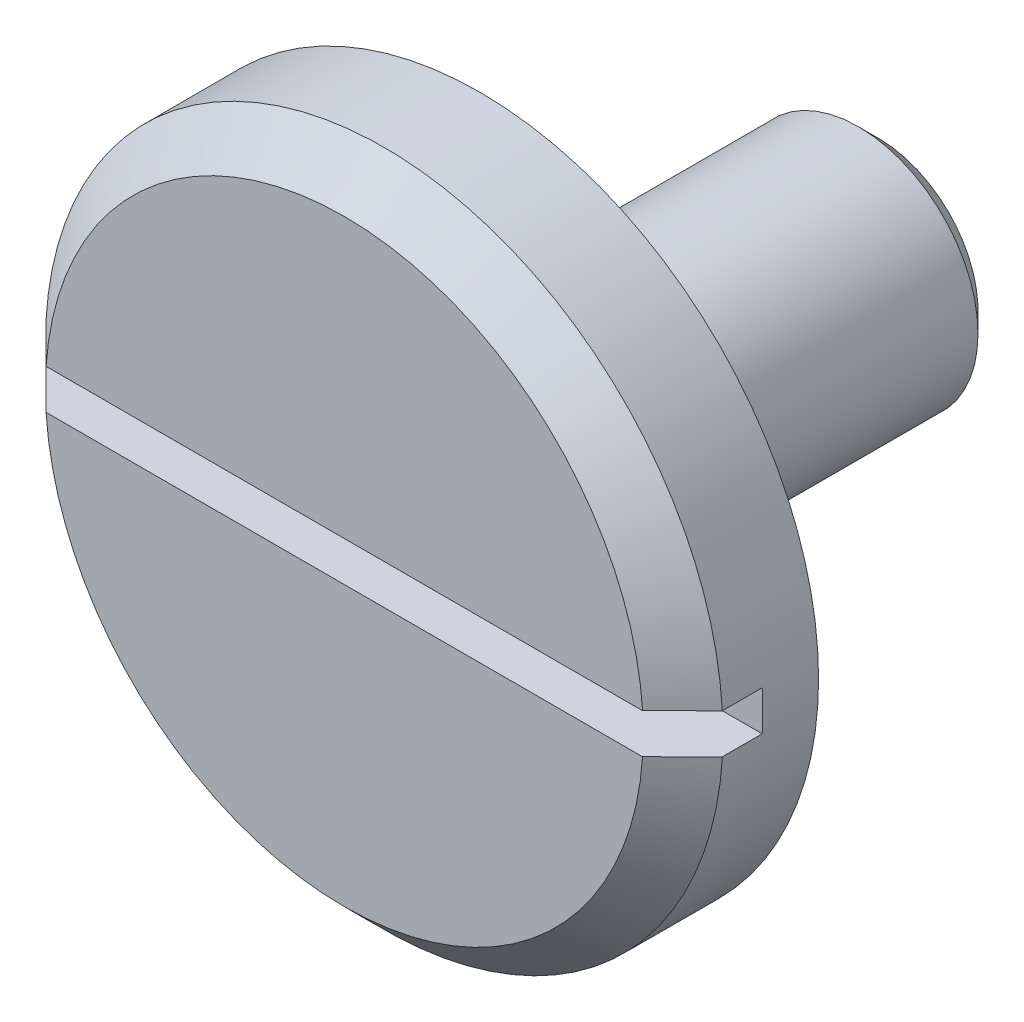
ISO-10303-21;
HEADER;
FILE_DESCRIPTION(('STEP AP214'),'2;1');
FILE_NAME('part.step','',(''),(''),'','','');
FILE_SCHEMA(('AUTOMOTIVE_DESIGN { 1 0 10303 214 1 1 1 1 }'));
ENDSEC;
DATA;
#1=APPLICATION_CONTEXT('core data for automotive mechanical design processes');
#2=APPLICATION_PROTOCOL_DEFINITION('international standard','automotive_design',2000,#1);
#3=PRODUCT_CONTEXT('',#1,'mechanical');
#4=PRODUCT('Part','Part','',(#3));
#5=PRODUCT_RELATED_PRODUCT_CATEGORY('part','',(#4));
#6=PRODUCT_DEFINITION_FORMATION('','',#4);
#7=PRODUCT_DEFINITION_CONTEXT('part definition',#1,'design');
#8=PRODUCT_DEFINITION('design','',#6,#7);
#9=PRODUCT_DEFINITION_SHAPE('','',#8);
#10=(LENGTH_UNIT() NAMED_UNIT(*) SI_UNIT(.MILLI.,.METRE.));
#11=(NAMED_UNIT(*) PLANE_ANGLE_UNIT() SI_UNIT($,.RADIAN.));
#12=(NAMED_UNIT(*) SI_UNIT($,.STERADIAN.) SOLID_ANGLE_UNIT());
#13=UNCERTAINTY_MEASURE_WITH_UNIT(LENGTH_MEASURE(1.E-05),#10,'distance_accuracy_value','');
#14=(GEOMETRIC_REPRESENTATION_CONTEXT(3) GLOBAL_UNCERTAINTY_ASSIGNED_CONTEXT((#13)) GLOBAL_UNIT_ASSIGNED_CONTEXT((#10,
#11,#12)) REPRESENTATION_CONTEXT('',''));
#15=CARTESIAN_POINT('',(0.,0.,0.));
#16=DIRECTION('',(0.,0.,1.));
#17=DIRECTION('',(1.,0.,0.));
#18=AXIS2_PLACEMENT_3D('',#15,#16,#17);
#19=CARTESIAN_POINT('',(0.,0.,1.7));
#20=DIRECTION('',(0.,0.,1.));
#21=DIRECTION('',(1.,0.,0.));
#22=AXIS2_PLACEMENT_3D('',#19,#20,#21);
#23=PLANE('',#22);
#24=DIRECTION('',(1.,0.,0.));
#25=VECTOR('',#24,1.);
#26=CARTESIAN_POINT('',(0.,-0.25,1.7));
#27=LINE('',#26,#25);
#28=CARTESIAN_POINT('',(-3.74165738677394,-0.25,1.7));
#29=VERTEX_POINT('',#28);
#30=CARTESIAN_POINT('',(3.74165738677394,-0.25,1.7));
#31=VERTEX_POINT('',#30);
#32=EDGE_CURVE('E148',#29,#31,#27,.T.);
#33=ORIENTED_EDGE('',*,*,#32,.F.);
#34=CARTESIAN_POINT('',(0.,0.,1.7));
#35=DIRECTION('',(0.,0.,1.));
#36=DIRECTION('',(1.,0.,0.));
#37=AXIS2_PLACEMENT_3D('',#34,#35,#36);
#38=CIRCLE('',#37,3.75);
#39=EDGE_CURVE('E146',#29,#31,#38,.T.);
#40=ORIENTED_EDGE('',*,*,#39,.T.);
#41=EDGE_LOOP('',(#33,#40));
#42=FACE_BOUND('',#41,.T.);
#43=ADVANCED_FACE('F17',(#42),#23,.T.);
#44=CARTESIAN_POINT('',(0.,0.,1.7));
#45=DIRECTION('',(0.,0.,-1.));
#46=DIRECTION('',(-1.,0.,0.));
#47=AXIS2_PLACEMENT_3D('',#44,#45,#46);
#48=CONICAL_SURFACE('',#47,3.75,0.785398163397446);
#49=CARTESIAN_POINT('',(-9.35567628765958,-0.25,-3.90901590977793));
#50=CARTESIAN_POINT('',(-9.03289795511798,-0.25,-3.58635366815301));
#51=CARTESIAN_POINT('',(-8.71011452870455,-0.25,-3.26369652197986));
#52=CARTESIAN_POINT('',(-8.06453073076949,-0.25,-2.61839880551686));
#53=CARTESIAN_POINT('',(-7.74173035923807,-0.25,-2.2957582352368));
#54=CARTESIAN_POINT('',(-7.09610227505754,-0.25,-1.65049641906794));
#55=CARTESIAN_POINT('',(-6.77327456211828,-0.25,-1.32787517346944));
#56=CARTESIAN_POINT('',(-6.12758359196436,-0.25,-0.682668622659213));
#57=CARTESIAN_POINT('',(-5.80472033477004,-0.25,-0.36008331742714));
#58=CARTESIAN_POINT('',(-5.15827646112178,-0.25,0.285690453985219));
#59=CARTESIAN_POINT('',(-4.83469572847146,-0.25,0.608878803879873));
#60=CARTESIAN_POINT('',(-4.18742956751692,-0.25,1.25515169326864));
#61=CARTESIAN_POINT('',(-3.86374413903944,-0.25,1.57823623258917));
#62=CARTESIAN_POINT('',(-3.21617952646215,-0.25,2.22420650381016));
#63=CARTESIAN_POINT('',(-2.89230034381217,-0.25,2.54709223716245));
#64=CARTESIAN_POINT('',(-2.40607894141502,-0.25,3.03101538689873));
#65=CARTESIAN_POINT('',(-2.24393826138762,-0.25,3.19225530473262));
#66=CARTESIAN_POINT('',(-1.91940680223726,-0.25,3.51448318198386));
#67=CARTESIAN_POINT('',(-1.75701602349966,-0.25,3.67547114178867));
#68=CARTESIAN_POINT('',(-1.50530141866896,-0.25,3.92413946138201));
#69=CARTESIAN_POINT('',(-1.41617455837397,-0.25,4.01201917295412));
#70=CARTESIAN_POINT('',(-1.23765038056176,-0.25,4.18746480083215));
#71=CARTESIAN_POINT('',(-1.14825312704963,-0.25,4.27503078208907));
#72=CARTESIAN_POINT('',(-0.998577315255739,-0.25,4.42069391489895));
#73=CARTESIAN_POINT('',(-0.938454879044106,-0.25,4.47895147271359));
#74=CARTESIAN_POINT('',(-0.817756566178237,-0.25,4.59504780670183));
#75=CARTESIAN_POINT('',(-0.757180512126432,-0.25,4.65288639954022));
#76=CARTESIAN_POINT('',(-0.655349243453546,-0.25,4.74871800148552));
#77=CARTESIAN_POINT('',(-0.61432302351699,-0.25,4.78695420897481));
#78=CARTESIAN_POINT('',(-0.531691585641791,-0.25,4.86270603450101));
#79=CARTESIAN_POINT('',(-0.490087104542302,-0.25,4.90022244632364));
#80=CARTESIAN_POINT('',(-0.421254782066491,-0.25,4.96031538450716));
#81=CARTESIAN_POINT('',(-0.394383398287751,-0.25,4.9832991654084));
#82=CARTESIAN_POINT('',(-0.339786218340251,-0.25,5.02844131170172));
#83=CARTESIAN_POINT('',(-0.312057828764228,-0.25,5.05059660639396));
#84=CARTESIAN_POINT('',(-0.269353377422057,-0.25,5.08262575986691));
#85=CARTESIAN_POINT('',(-0.254865443823042,-0.25,5.09314613685171));
#86=CARTESIAN_POINT('',(-0.225439804610927,-0.25,5.11353349573733));
#87=CARTESIAN_POINT('',(-0.210502265739991,-0.25,5.12340071563076));
#88=CARTESIAN_POINT('',(-0.180070613664776,-0.25,5.1421332304044));
#89=CARTESIAN_POINT('',(-0.164578557922666,-0.25,5.15100180701027));
#90=CARTESIAN_POINT('',(-0.132836114570933,-0.25,5.16722892063403));
#91=CARTESIAN_POINT('',(-0.116587152438204,-0.25,5.17459016565737));
#92=CARTESIAN_POINT('',(-0.0828789519828765,-0.25,5.18709143745283));
#93=CARTESIAN_POINT('',(-0.0654034217319248,-0.25,5.19218999585914));
#94=CARTESIAN_POINT('',(-0.0298594686385596,-0.25,5.19881595864399));
#95=CARTESIAN_POINT('',(-0.0117961010499945,-0.25,5.20036831452469));
#96=CARTESIAN_POINT('',(0.0242801156069588,-0.25,5.19947586860602));
#97=CARTESIAN_POINT('',(0.0422926209502668,-0.25,5.19701833016421));
#98=CARTESIAN_POINT('',(0.0776232839262932,-0.25,5.18880295755528));
#99=CARTESIAN_POINT('',(0.094935354644901,-0.25,5.18302096366588));
#100=CARTESIAN_POINT('',(0.131813374015776,-0.25,5.16797456650949));
#101=CARTESIAN_POINT('',(0.151185880811856,-0.25,5.15825821867508));
#102=CARTESIAN_POINT('',(0.188936224675288,-0.25,5.13702445076799));
#103=CARTESIAN_POINT('',(0.207311473331325,-0.25,5.12550261980762));
#104=CARTESIAN_POINT('',(0.243451913275515,-0.25,5.10130526058208));
#105=CARTESIAN_POINT('',(0.261212230639947,-0.25,5.08862256455291));
#106=CARTESIAN_POINT('',(0.296188825238547,-0.25,5.06258111466196));
#107=CARTESIAN_POINT('',(0.31340576218893,-0.25,5.04922323620344));
#108=CARTESIAN_POINT('',(0.369750110452784,-0.25,5.00430823576812));
#109=CARTESIAN_POINT('',(0.408101593520283,-0.25,4.97178480734219));
#110=CARTESIAN_POINT('',(0.483870367767817,-0.25,4.90566250823166));
#111=CARTESIAN_POINT('',(0.52128725719143,-0.25,4.87206318874593));
#112=CARTESIAN_POINT('',(0.595623575443264,-0.25,4.80421715174497));
#113=CARTESIAN_POINT('',(0.632542257663815,-0.25,4.76996961512057));
#114=CARTESIAN_POINT('',(0.706032816764809,-0.25,4.70112058074332));
#115=CARTESIAN_POINT('',(0.74260475854595,-0.25,4.66651915185493));
#116=CARTESIAN_POINT('',(0.851628828675026,-0.25,4.56271770193691));
#117=CARTESIAN_POINT('',(0.923757663550666,-0.25,4.49317841602241));
#118=CARTESIAN_POINT('',(1.06753820133466,-0.25,4.35371194243637));
#119=CARTESIAN_POINT('',(1.13919020542836,-0.25,4.28378506364941));
#120=CARTESIAN_POINT('',(1.35355801990695,-0.25,4.07386183545476));
#121=CARTESIAN_POINT('',(1.49591608100667,-0.25,3.93350028742134));
#122=CARTESIAN_POINT('',(1.7802549900109,-0.25,3.65239396792892));
#123=CARTESIAN_POINT('',(1.92223583376127,-0.25,3.51164919228385));
#124=CARTESIAN_POINT('',(2.20603247547949,-0.25,3.2299136937886));
#125=CARTESIAN_POINT('',(2.34784821603541,-0.25,3.08892291306126));
#126=CARTESIAN_POINT('',(2.63136259054097,-0.25,2.80682486944753));
#127=CARTESIAN_POINT('',(2.7730612249459,-0.25,2.66571760701829));
#128=CARTESIAN_POINT('',(3.19851284165071,-0.25,2.24182585205158));
#129=CARTESIAN_POINT('',(3.48215757654313,-0.25,1.95893271056423));
#130=CARTESIAN_POINT('',(4.0492921658172,-0.25,1.39303872451224));
#131=CARTESIAN_POINT('',(4.33278203117083,-0.25,1.11003789093788));
#132=CARTESIAN_POINT('',(5.01175647078467,-0.25,0.43205860327421));
#133=CARTESIAN_POINT('',(5.40720622791221,-0.25,0.0370452791644757));
#134=CARTESIAN_POINT('',(6.19804706146249,-0.25,-0.753064559066025));
#135=CARTESIAN_POINT('',(6.59343813569107,-0.25,-1.14816107538256));
#136=CARTESIAN_POINT('',(7.38332448078106,-0.25,-1.93754209784194));
#137=CARTESIAN_POINT('',(7.77781984144278,-0.25,-2.33182651412562));
#138=CARTESIAN_POINT('',(8.56677107936066,-0.25,-3.12041040831111));
#139=CARTESIAN_POINT('',(8.96122695746138,-0.25,-3.51470988536798));
#140=CARTESIAN_POINT('',(9.35567628765958,-0.25,-3.90901590977793));
#141=B_SPLINE_CURVE_WITH_KNOTS('',3,(#49,#50,#51,#52,#53,#54,#55,#56,#57,#58,#59,#60,#61,#62,
#63,#64,#65,#66,#67,#68,#69,#70,#71,#72,#73,#74,#75,#76,#77,#78,#79,#80,#81,#82,#83,#84,#85,#86,
#87,#88,#89,#90,#91,#92,#93,#94,#95,#96,#97,#98,#99,#100,#101,#102,#103,#104,#105,#106,#107,
#108,#109,#110,#111,#112,#113,#114,#115,#116,#117,#118,#119,#120,#121,#122,#123,#124,#125,#126,
#127,#128,#129,#130,#131,#132,#133,#134,#135,#136,#137,#138,#139,#140),.UNSPECIFIED.,.F.,.F.,(4,
2,2,2,2,2,2,2,2,2,2,2,2,2,2,2,2,2,2,2,2,2,2,2,2,2,2,2,2,2,2,2,2,2,2,2,2,2,2,2,2,2,2,2,2,4),(0.,
1.36918624275953,2.73837328476362,4.10757735811051,5.47678065256779,6.8487852862026,
8.22079220212584,9.5927889769464,10.2787854585288,10.9647808841589,11.3402776733529,
11.7156916219967,11.9668440818869,12.2181005051892,12.3863434324342,12.5543887054579,
12.660461006955,12.7668938024204,12.8205961919259,12.8742789047935,12.927779713933,
12.9811835458565,13.035529324082,13.0894915254007,13.1436254609591,13.1981578665577,
13.2630098537905,13.3280228214987,13.393468463446,13.4588313263653,13.6096294024203,
13.7604912241057,13.9115584330971,14.0625967847507,14.3631652462608,14.6635212807266,
15.2632721534925,15.863029603924,16.4629551527257,17.0628783581131,18.2646875904248,
19.4663962803467,21.1432219215734,22.8200994441906,24.4933540891646,26.166556900069),.UNSPECIFIED.);
#142=CARTESIAN_POINT('',(-4.24264068711928,-0.25,1.2));
#143=VERTEX_POINT('',#142);
#144=EDGE_CURVE('E89',#143,#29,#141,.T.);
#145=ORIENTED_EDGE('',*,*,#144,.F.);
#146=CARTESIAN_POINT('',(0.,0.,1.2));
#147=DIRECTION('',(0.,0.,1.));
#148=DIRECTION('',(1.,0.,0.));
#149=AXIS2_PLACEMENT_3D('',#146,#147,#148);
#150=CIRCLE('',#149,4.25);
#151=CARTESIAN_POINT('',(4.24264068711928,-0.25,1.2));
#152=VERTEX_POINT('',#151);
#153=EDGE_CURVE('E162',#152,#143,#150,.F.);
#154=ORIENTED_EDGE('',*,*,#153,.F.);
#155=EDGE_CURVE('E93',#31,#152,#141,.T.);
#156=ORIENTED_EDGE('',*,*,#155,.F.);
#157=ORIENTED_EDGE('',*,*,#39,.F.);
#158=EDGE_LOOP('',(#145,#154,#156,#157));
#159=FACE_BOUND('',#158,.T.);
#160=ADVANCED_FACE('F132',(#159),#48,.T.);
#161=CARTESIAN_POINT('',(0.,0.,1.7));
#162=DIRECTION('',(0.,0.,-1.));
#163=DIRECTION('',(-1.,0.,0.));
#164=AXIS2_PLACEMENT_3D('',#161,#162,#163);
#165=CYLINDRICAL_SURFACE('',#164,4.25);
#166=CARTESIAN_POINT('',(0.,0.,0.7));
#167=DIRECTION('',(0.,0.,-1.));
#168=DIRECTION('',(-1.,0.,0.));
#169=AXIS2_PLACEMENT_3D('',#166,#167,#168);
#170=CIRCLE('',#169,4.25);
#171=CARTESIAN_POINT('',(4.24264068711928,0.25,0.7));
#172=VERTEX_POINT('',#171);
#173=CARTESIAN_POINT('',(4.24264068711928,-0.25,0.7));
#174=VERTEX_POINT('',#173);
#175=EDGE_CURVE('E11',#172,#174,#170,.T.);
#176=ORIENTED_EDGE('',*,*,#175,.T.);
#177=DIRECTION('',(0.,0.,-1.));
#178=VECTOR('',#177,1.);
#179=CARTESIAN_POINT('',(4.24264068711928,-0.25,1.7));
#180=LINE('',#179,#178);
#181=EDGE_CURVE('E147',#174,#152,#180,.F.);
#182=ORIENTED_EDGE('',*,*,#181,.T.);
#183=ORIENTED_EDGE('',*,*,#153,.T.);
#184=DIRECTION('',(0.,0.,-1.));
#185=VECTOR('',#184,1.);
#186=CARTESIAN_POINT('',(-4.24264068711928,-0.25,1.7));
#187=LINE('',#186,#185);
#188=CARTESIAN_POINT('',(-4.24264068711928,-0.25,0.7));
#189=VERTEX_POINT('',#188);
#190=EDGE_CURVE('E37',#143,#189,#187,.T.);
#191=ORIENTED_EDGE('',*,*,#190,.T.);
#192=CARTESIAN_POINT('',(-4.24264068711928,0.25,0.7));
#193=VERTEX_POINT('',#192);
#194=EDGE_CURVE('E21',#189,#193,#170,.T.);
#195=ORIENTED_EDGE('',*,*,#194,.T.);
#196=DIRECTION('',(0.,0.,-1.));
#197=VECTOR('',#196,1.);
#198=CARTESIAN_POINT('',(-4.24264068711928,0.25,1.7));
#199=LINE('',#198,#197);
#200=CARTESIAN_POINT('',(-4.24264068711928,0.25,1.2));
#201=VERTEX_POINT('',#200);
#202=EDGE_CURVE('E67',#193,#201,#199,.F.);
#203=ORIENTED_EDGE('',*,*,#202,.T.);
#204=CARTESIAN_POINT('',(4.24264068711928,0.25,1.2));
#205=VERTEX_POINT('',#204);
#206=EDGE_CURVE('E160',#201,#205,#150,.F.);
#207=ORIENTED_EDGE('',*,*,#206,.T.);
#208=DIRECTION('',(0.,0.,-1.));
#209=VECTOR('',#208,1.);
#210=CARTESIAN_POINT('',(4.24264068711928,0.25,1.7));
#211=LINE('',#210,#209);
#212=EDGE_CURVE('E79',#205,#172,#211,.T.);
#213=ORIENTED_EDGE('',*,*,#212,.T.);
#214=EDGE_LOOP('',(#176,#182,#183,#191,#195,#203,#207,#213));
#215=FACE_BOUND('',#214,.T.);
#216=CARTESIAN_POINT('',(0.,0.,0.));
#217=DIRECTION('',(0.,0.,1.));
#218=DIRECTION('',(1.,0.,0.));
#219=AXIS2_PLACEMENT_3D('',#216,#217,#218);
#220=CIRCLE('',#219,4.25);
#221=CARTESIAN_POINT('',(4.25,0.,0.));
#222=VERTEX_POINT('',#221);
#223=EDGE_CURVE('E157',#222,#222,#220,.T.);
#224=ORIENTED_EDGE('',*,*,#223,.T.);
#225=EDGE_LOOP('',(#224));
#226=FACE_BOUND('',#225,.T.);
#227=ADVANCED_FACE('F87',(#215,#226),#165,.T.);
#228=DIRECTION('',(-1.,0.,0.));
#229=VECTOR('',#228,1.);
#230=CARTESIAN_POINT('',(0.,0.25,1.7));
#231=LINE('',#230,#229);
#232=CARTESIAN_POINT('',(3.74165738677394,0.25,1.7));
#233=VERTEX_POINT('',#232);
#234=CARTESIAN_POINT('',(-3.74165738677394,0.25,1.7));
#235=VERTEX_POINT('',#234);
#236=EDGE_CURVE('E32',#233,#235,#231,.T.);
#237=ORIENTED_EDGE('',*,*,#236,.F.);
#238=EDGE_CURVE('E153',#233,#235,#38,.T.);
#239=ORIENTED_EDGE('',*,*,#238,.T.);
#240=EDGE_LOOP('',(#237,#239));
#241=FACE_BOUND('',#240,.T.);
#242=ADVANCED_FACE('F130',(#241),#23,.T.);
#243=CARTESIAN_POINT('',(0.,0.,0.));
#244=DIRECTION('',(0.,0.,1.));
#245=DIRECTION('',(1.,0.,0.));
#246=AXIS2_PLACEMENT_3D('',#243,#244,#245);
#247=PLANE('',#246);
#248=CARTESIAN_POINT('',(0.,0.,0.));
#249=DIRECTION('',(0.,0.,1.));
#250=DIRECTION('',(1.,0.,0.));
#251=AXIS2_PLACEMENT_3D('',#248,#249,#250);
#252=CIRCLE('',#251,1.5);
#253=CARTESIAN_POINT('',(1.5,0.,0.));
#254=VERTEX_POINT('',#253);
#255=EDGE_CURVE('E152',#254,#254,#252,.F.);
#256=ORIENTED_EDGE('',*,*,#255,.F.);
#257=EDGE_LOOP('',(#256));
#258=FACE_BOUND('',#257,.T.);
#259=ORIENTED_EDGE('',*,*,#223,.F.);
#260=EDGE_LOOP('',(#259));
#261=FACE_BOUND('',#260,.T.);
#262=ADVANCED_FACE('F123',(#258,#261),#247,.F.);
#263=CARTESIAN_POINT('',(0.,0.,-5.));
#264=DIRECTION('',(0.,0.,1.));
#265=DIRECTION('',(1.,0.,0.));
#266=AXIS2_PLACEMENT_3D('',#263,#264,#265);
#267=CYLINDRICAL_SURFACE('',#266,1.5);
#268=CARTESIAN_POINT('',(0.,0.,-4.75));
#269=DIRECTION('',(0.,0.,-1.));
#270=DIRECTION('',(-1.,0.,0.));
#271=AXIS2_PLACEMENT_3D('',#268,#269,#270);
#272=CIRCLE('',#271,1.5);
#273=CARTESIAN_POINT('',(-1.5,0.,-4.75));
#274=VERTEX_POINT('',#273);
#275=EDGE_CURVE('E170',#274,#274,#272,.F.);
#276=ORIENTED_EDGE('',*,*,#275,.T.);
#277=EDGE_LOOP('',(#276));
#278=FACE_BOUND('',#277,.T.);
#279=ORIENTED_EDGE('',*,*,#255,.T.);
#280=EDGE_LOOP('',(#279));
#281=FACE_BOUND('',#280,.T.);
#282=ADVANCED_FACE('F120',(#278,#281),#267,.T.);
#283=CARTESIAN_POINT('',(0.,0.,-5.));
#284=DIRECTION('',(0.,0.,-1.));
#285=DIRECTION('',(-1.,0.,0.));
#286=AXIS2_PLACEMENT_3D('',#283,#284,#285);
#287=PLANE('',#286);
#288=CARTESIAN_POINT('',(0.,0.,-5.));
#289=DIRECTION('',(0.,0.,-1.));
#290=DIRECTION('',(-1.,0.,0.));
#291=AXIS2_PLACEMENT_3D('',#288,#289,#290);
#292=CIRCLE('',#291,1.25);
#293=CARTESIAN_POINT('',(-1.25,0.,-5.));
#294=VERTEX_POINT('',#293);
#295=EDGE_CURVE('E164',#294,#294,#292,.T.);
#296=ORIENTED_EDGE('',*,*,#295,.T.);
#297=EDGE_LOOP('',(#296));
#298=FACE_BOUND('',#297,.T.);
#299=ADVANCED_FACE('F117',(#298),#287,.T.);
#300=CARTESIAN_POINT('',(9.35567628765958,0.25,-3.90901590977793));
#301=CARTESIAN_POINT('',(9.03289795511798,0.25,-3.58635366815301));
#302=CARTESIAN_POINT('',(8.71011452870455,0.25,-3.26369652197986));
#303=CARTESIAN_POINT('',(8.06453073076949,0.25,-2.61839880551686));
#304=CARTESIAN_POINT('',(7.74173035923807,0.25,-2.2957582352368));
#305=CARTESIAN_POINT('',(7.09610227505754,0.25,-1.65049641906793));
#306=CARTESIAN_POINT('',(6.77327456211828,0.25,-1.32787517346944));
#307=CARTESIAN_POINT('',(6.12758359196436,0.25,-0.682668622659212));
#308=CARTESIAN_POINT('',(5.80472033477004,0.25,-0.360083317427139));
#309=CARTESIAN_POINT('',(5.15827646112178,0.25,0.285690453985219));
#310=CARTESIAN_POINT('',(4.83469572847146,0.25,0.608878803879874));
#311=CARTESIAN_POINT('',(4.18742956751692,0.25,1.25515169326864));
#312=CARTESIAN_POINT('',(3.86374413903944,0.25,1.57823623258917));
#313=CARTESIAN_POINT('',(3.21617952646215,0.25,2.22420650381016));
#314=CARTESIAN_POINT('',(2.89230034381217,0.25,2.54709223716245));
#315=CARTESIAN_POINT('',(2.40607894141502,0.25,3.03101538689873));
#316=CARTESIAN_POINT('',(2.24393826138762,0.25,3.19225530473262));
#317=CARTESIAN_POINT('',(1.91940680223726,0.25,3.51448318198386));
#318=CARTESIAN_POINT('',(1.75701602349966,0.25,3.67547114178867));
#319=CARTESIAN_POINT('',(1.50530141866896,0.25,3.92413946138201));
#320=CARTESIAN_POINT('',(1.41617455837397,0.25,4.01201917295412));
#321=CARTESIAN_POINT('',(1.23765038056176,0.25,4.18746480083215));
#322=CARTESIAN_POINT('',(1.14825312704963,0.25,4.27503078208907));
#323=CARTESIAN_POINT('',(0.998577315255739,0.25,4.42069391489895));
#324=CARTESIAN_POINT('',(0.938454879044105,0.25,4.47895147271359));
#325=CARTESIAN_POINT('',(0.817756566178237,0.25,4.59504780670183));
#326=CARTESIAN_POINT('',(0.757180512126433,0.25,4.65288639954022));
#327=CARTESIAN_POINT('',(0.655349243453546,0.25,4.74871800148552));
#328=CARTESIAN_POINT('',(0.61432302351699,0.25,4.78695420897481));
#329=CARTESIAN_POINT('',(0.53169158564179,0.25,4.86270603450101));
#330=CARTESIAN_POINT('',(0.490087104542302,0.25,4.90022244632364));
#331=CARTESIAN_POINT('',(0.421254782066491,0.25,4.96031538450716));
#332=CARTESIAN_POINT('',(0.394383398287751,0.25,4.9832991654084));
#333=CARTESIAN_POINT('',(0.339786218340251,0.25,5.02844131170172));
#334=CARTESIAN_POINT('',(0.312057828764229,0.25,5.05059660639397));
#335=CARTESIAN_POINT('',(0.269353377422056,0.25,5.08262575986691));
#336=CARTESIAN_POINT('',(0.254865443823041,0.25,5.09314613685171));
#337=CARTESIAN_POINT('',(0.225439804610925,0.25,5.11353349573733));
#338=CARTESIAN_POINT('',(0.210502265739989,0.25,5.12340071563076));
#339=CARTESIAN_POINT('',(0.180070613664775,0.25,5.1421332304044));
#340=CARTESIAN_POINT('',(0.164578557922665,0.25,5.15100180701027));
#341=CARTESIAN_POINT('',(0.132836114570933,0.25,5.16722892063403));
#342=CARTESIAN_POINT('',(0.116587152438204,0.25,5.17459016565737));
#343=CARTESIAN_POINT('',(0.0828789519828761,0.25,5.18709143745283));
#344=CARTESIAN_POINT('',(0.0654034217319237,0.25,5.19218999585914));
#345=CARTESIAN_POINT('',(0.0298594686385585,0.25,5.19881595864399));
#346=CARTESIAN_POINT('',(0.011796101049994,0.25,5.20036831452469));
#347=CARTESIAN_POINT('',(-0.0242801156069592,0.25,5.19947586860602));
#348=CARTESIAN_POINT('',(-0.0422926209502677,0.25,5.19701833016421));
#349=CARTESIAN_POINT('',(-0.077623283926294,0.25,5.18880295755528));
#350=CARTESIAN_POINT('',(-0.0949353546449013,0.25,5.18302096366587));
#351=CARTESIAN_POINT('',(-0.131813374015776,0.25,5.16797456650949));
#352=CARTESIAN_POINT('',(-0.151185880811858,0.25,5.15825821867508));
#353=CARTESIAN_POINT('',(-0.18893622467529,0.25,5.13702445076799));
#354=CARTESIAN_POINT('',(-0.207311473331327,0.25,5.12550261980762));
#355=CARTESIAN_POINT('',(-0.243451913275516,0.25,5.10130526058207));
#356=CARTESIAN_POINT('',(-0.261212230639948,0.25,5.08862256455291));
#357=CARTESIAN_POINT('',(-0.296188825238547,0.25,5.06258111466196));
#358=CARTESIAN_POINT('',(-0.31340576218893,0.25,5.04922323620344));
#359=CARTESIAN_POINT('',(-0.369750110452783,0.25,5.00430823576812));
#360=CARTESIAN_POINT('',(-0.408101593520282,0.25,4.97178480734219));
#361=CARTESIAN_POINT('',(-0.483870367767816,0.25,4.90566250823167));
#362=CARTESIAN_POINT('',(-0.521287257191429,0.25,4.87206318874593));
#363=CARTESIAN_POINT('',(-0.595623575443262,0.25,4.80421715174497));
#364=CARTESIAN_POINT('',(-0.632542257663815,0.25,4.76996961512057));
#365=CARTESIAN_POINT('',(-0.706032816764808,0.25,4.70112058074332));
#366=CARTESIAN_POINT('',(-0.742604758545949,0.25,4.66651915185493));
#367=CARTESIAN_POINT('',(-0.851628828675024,0.25,4.56271770193691));
#368=CARTESIAN_POINT('',(-0.923757663550663,0.25,4.49317841602242));
#369=CARTESIAN_POINT('',(-1.06753820133466,0.25,4.35371194243637));
#370=CARTESIAN_POINT('',(-1.13919020542836,0.25,4.28378506364941));
#371=CARTESIAN_POINT('',(-1.35355801990695,0.25,4.07386183545477));
#372=CARTESIAN_POINT('',(-1.49591608100667,0.25,3.93350028742135));
#373=CARTESIAN_POINT('',(-1.7802549900109,0.25,3.65239396792892));
#374=CARTESIAN_POINT('',(-1.92223583376127,0.25,3.51164919228386));
#375=CARTESIAN_POINT('',(-2.20603247547949,0.25,3.22991369378861));
#376=CARTESIAN_POINT('',(-2.3478482160354,0.25,3.08892291306126));
#377=CARTESIAN_POINT('',(-2.63136259054097,0.25,2.80682486944753));
#378=CARTESIAN_POINT('',(-2.77306122494589,0.25,2.66571760701829));
#379=CARTESIAN_POINT('',(-3.19851284165071,0.25,2.24182585205159));
#380=CARTESIAN_POINT('',(-3.48215757654313,0.25,1.95893271056424));
#381=CARTESIAN_POINT('',(-4.04929216581719,0.25,1.39303872451225));
#382=CARTESIAN_POINT('',(-4.33278203117082,0.25,1.11003789093788));
#383=CARTESIAN_POINT('',(-5.01175647078466,0.25,0.432058603274214));
#384=CARTESIAN_POINT('',(-5.4072062279122,0.25,0.0370452791644808));
#385=CARTESIAN_POINT('',(-6.19804706146248,0.25,-0.75306455906602));
#386=CARTESIAN_POINT('',(-6.59343813569107,0.25,-1.14816107538256));
#387=CARTESIAN_POINT('',(-7.38332448078106,0.25,-1.93754209784194));
#388=CARTESIAN_POINT('',(-7.77781984144278,0.25,-2.33182651412562));
#389=CARTESIAN_POINT('',(-8.56677107936066,0.25,-3.12041040831111));
#390=CARTESIAN_POINT('',(-8.96122695746138,0.25,-3.51470988536798));
#391=CARTESIAN_POINT('',(-9.35567628765958,0.25,-3.90901590977793));
#392=B_SPLINE_CURVE_WITH_KNOTS('',3,(#300,#301,#302,#303,#304,#305,#306,#307,#308,#309,#310,
#311,#312,#313,#314,#315,#316,#317,#318,#319,#320,#321,#322,#323,#324,#325,#326,#327,#328,#329,
#330,#331,#332,#333,#334,#335,#336,#337,#338,#339,#340,#341,#342,#343,#344,#345,#346,#347,#348,
#349,#350,#351,#352,#353,#354,#355,#356,#357,#358,#359,#360,#361,#362,#363,#364,#365,#366,#367,
#368,#369,#370,#371,#372,#373,#374,#375,#376,#377,#378,#379,#380,#381,#382,#383,#384,#385,#386,
#387,#388,#389,#390,#391),.UNSPECIFIED.,.F.,.F.,(4,2,2,2,2,2,2,2,2,2,2,2,2,2,2,2,2,2,2,2,2,2,2,
2,2,2,2,2,2,2,2,2,2,2,2,2,2,2,2,2,2,2,2,2,2,4),(0.,1.36918624275954,2.73837328476362,
4.10757735811051,5.47678065256779,6.8487852862026,8.22079220212584,9.5927889769464,
10.2787854585288,10.9647808841589,11.3402776733529,11.7156916219967,11.9668440818869,
12.2181005051892,12.3863434324342,12.5543887054579,12.660461006955,12.7668938024204,
12.8205961919259,12.8742789047935,12.927779713933,12.9811835458565,13.035529324082,
13.0894915254007,13.1436254609591,13.1981578665577,13.2630098537906,13.3280228214988,
13.393468463446,13.4588313263653,13.6096294024203,13.7604912241057,13.9115584330971,
14.0625967847507,14.3631652462608,14.6635212807266,15.2632721534925,15.863029603924,
16.4629551527257,17.0628783581131,18.2646875904248,19.4663962803467,21.1432219215734,
22.8200994441906,24.4933540891646,26.1665569000691),.UNSPECIFIED.);
#393=EDGE_CURVE('E91',#205,#233,#392,.T.);
#394=ORIENTED_EDGE('',*,*,#393,.F.);
#395=ORIENTED_EDGE('',*,*,#206,.F.);
#396=EDGE_CURVE('E74',#235,#201,#392,.T.);
#397=ORIENTED_EDGE('',*,*,#396,.F.);
#398=ORIENTED_EDGE('',*,*,#238,.F.);
#399=EDGE_LOOP('',(#394,#395,#397,#398));
#400=FACE_BOUND('',#399,.T.);
#401=ADVANCED_FACE('F106',(#400),#48,.T.);
#402=CARTESIAN_POINT('',(0.,0.,-5.));
#403=DIRECTION('',(0.,0.,1.));
#404=DIRECTION('',(1.,0.,0.));
#405=AXIS2_PLACEMENT_3D('',#402,#403,#404);
#406=CONICAL_SURFACE('',#405,1.25,0.785398163397445);
#407=ORIENTED_EDGE('',*,*,#275,.F.);
#408=EDGE_LOOP('',(#407));
#409=FACE_BOUND('',#408,.T.);
#410=ORIENTED_EDGE('',*,*,#295,.F.);
#411=EDGE_LOOP('',(#410));
#412=FACE_BOUND('',#411,.T.);
#413=ADVANCED_FACE('F19',(#409,#412),#406,.T.);
#414=CARTESIAN_POINT('',(-5.,0.25,0.7));
#415=DIRECTION('',(0.,0.,-1.));
#416=DIRECTION('',(-1.,0.,0.));
#417=AXIS2_PLACEMENT_3D('',#414,#415,#416);
#418=PLANE('',#417);
#419=DIRECTION('',(1.,0.,0.));
#420=VECTOR('',#419,1.);
#421=CARTESIAN_POINT('',(-5.,0.25,0.7));
#422=LINE('',#421,#420);
#423=EDGE_CURVE('E73',#193,#172,#422,.T.);
#424=ORIENTED_EDGE('',*,*,#423,.F.);
#425=ORIENTED_EDGE('',*,*,#194,.F.);
#426=DIRECTION('',(1.,0.,0.));
#427=VECTOR('',#426,1.);
#428=CARTESIAN_POINT('',(-5.,-0.25,0.7));
#429=LINE('',#428,#427);
#430=EDGE_CURVE('E83',#189,#174,#429,.T.);
#431=ORIENTED_EDGE('',*,*,#430,.T.);
#432=ORIENTED_EDGE('',*,*,#175,.F.);
#433=EDGE_LOOP('',(#424,#425,#431,#432));
#434=FACE_BOUND('',#433,.T.);
#435=ADVANCED_FACE('F84',(#434),#418,.F.);
#436=CARTESIAN_POINT('',(-5.,-0.25,2.7));
#437=DIRECTION('',(0.,-1.,0.));
#438=DIRECTION('',(0.,0.,-1.));
#439=AXIS2_PLACEMENT_3D('',#436,#437,#438);
#440=PLANE('',#439);
#441=ORIENTED_EDGE('',*,*,#144,.T.);
#442=ORIENTED_EDGE('',*,*,#32,.T.);
#443=ORIENTED_EDGE('',*,*,#155,.T.);
#444=ORIENTED_EDGE('',*,*,#181,.F.);
#445=ORIENTED_EDGE('',*,*,#430,.F.);
#446=ORIENTED_EDGE('',*,*,#190,.F.);
#447=EDGE_LOOP('',(#441,#442,#443,#444,#445,#446));
#448=FACE_BOUND('',#447,.T.);
#449=ADVANCED_FACE('F108',(#448),#440,.F.);
#450=CARTESIAN_POINT('',(-5.,0.25,2.7));
#451=DIRECTION('',(0.,1.,0.));
#452=DIRECTION('',(0.,0.,1.));
#453=AXIS2_PLACEMENT_3D('',#450,#451,#452);
#454=PLANE('',#453);
#455=ORIENTED_EDGE('',*,*,#393,.T.);
#456=ORIENTED_EDGE('',*,*,#236,.T.);
#457=ORIENTED_EDGE('',*,*,#396,.T.);
#458=ORIENTED_EDGE('',*,*,#202,.F.);
#459=ORIENTED_EDGE('',*,*,#423,.T.);
#460=ORIENTED_EDGE('',*,*,#212,.F.);
#461=EDGE_LOOP('',(#455,#456,#457,#458,#459,#460));
#462=FACE_BOUND('',#461,.T.);
#463=ADVANCED_FACE('F71',(#462),#454,.F.);
#464=CLOSED_SHELL('',(#43,#160,#227,#242,#262,#282,#299,#401,#413,#435,#449,#463));
#465=MANIFOLD_SOLID_BREP('B1',#464);
#466=ADVANCED_BREP_SHAPE_REPRESENTATION('',(#18,#465),#14);
#467=SHAPE_DEFINITION_REPRESENTATION(#9,#466);
ENDSEC;
END-ISO-10303-21;
